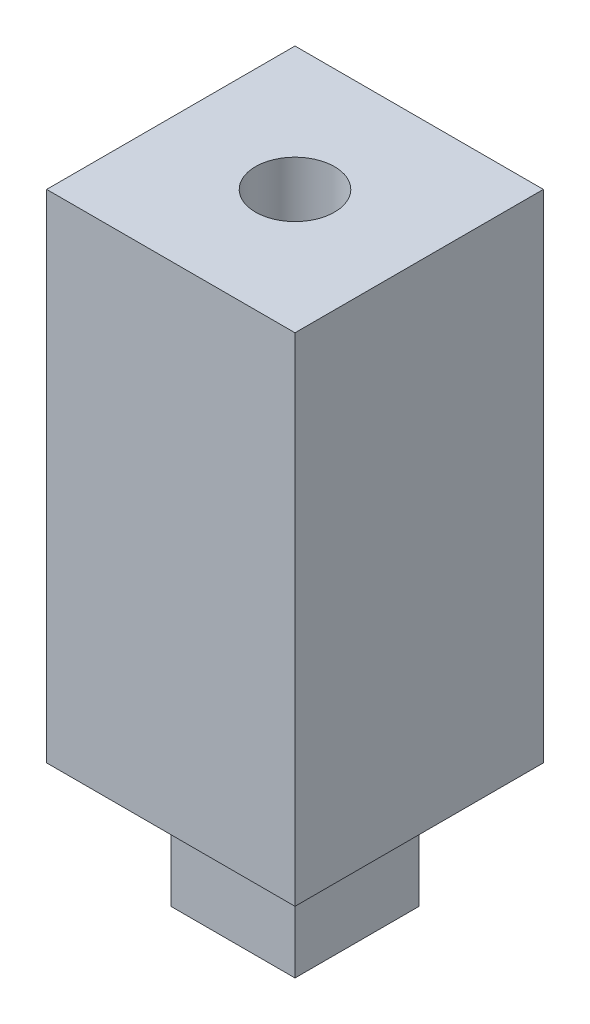
ISO-10303-21;
HEADER;
FILE_DESCRIPTION(('STEP AP214'),'2;1');
FILE_NAME('part.step','',(''),(''),'','','');
FILE_SCHEMA(('AUTOMOTIVE_DESIGN { 1 0 10303 214 1 1 1 1 }'));
ENDSEC;
DATA;
#1=APPLICATION_CONTEXT('core data for automotive mechanical design processes');
#2=APPLICATION_PROTOCOL_DEFINITION('international standard','automotive_design',2000,#1);
#3=PRODUCT_CONTEXT('',#1,'mechanical');
#4=PRODUCT('Part','Part','',(#3));
#5=PRODUCT_RELATED_PRODUCT_CATEGORY('part','',(#4));
#6=PRODUCT_DEFINITION_FORMATION('','',#4);
#7=PRODUCT_DEFINITION_CONTEXT('part definition',#1,'design');
#8=PRODUCT_DEFINITION('design','',#6,#7);
#9=PRODUCT_DEFINITION_SHAPE('','',#8);
#10=(LENGTH_UNIT() NAMED_UNIT(*) SI_UNIT(.MILLI.,.METRE.));
#11=(NAMED_UNIT(*) PLANE_ANGLE_UNIT() SI_UNIT($,.RADIAN.));
#12=(NAMED_UNIT(*) SI_UNIT($,.STERADIAN.) SOLID_ANGLE_UNIT());
#13=UNCERTAINTY_MEASURE_WITH_UNIT(LENGTH_MEASURE(1.E-05),#10,'distance_accuracy_value','');
#14=(GEOMETRIC_REPRESENTATION_CONTEXT(3) GLOBAL_UNCERTAINTY_ASSIGNED_CONTEXT((#13)) GLOBAL_UNIT_ASSIGNED_CONTEXT((#10,
#11,#12)) REPRESENTATION_CONTEXT('',''));
#15=CARTESIAN_POINT('',(0.,0.,0.));
#16=DIRECTION('',(0.,0.,1.));
#17=DIRECTION('',(1.,0.,0.));
#18=AXIS2_PLACEMENT_3D('',#15,#16,#17);
#19=CARTESIAN_POINT('',(0.,0.,0.));
#20=DIRECTION('',(0.,-1.,0.));
#21=DIRECTION('',(0.,0.,-1.));
#22=AXIS2_PLACEMENT_3D('',#19,#20,#21);
#23=PLANE('',#22);
#24=DIRECTION('',(0.,0.,-1.));
#25=VECTOR('',#24,1.);
#26=CARTESIAN_POINT('',(6.35,0.,6.35));
#27=LINE('',#26,#25);
#28=CARTESIAN_POINT('',(6.35,0.,6.35));
#29=VERTEX_POINT('',#28);
#30=CARTESIAN_POINT('',(6.35,0.,-6.35));
#31=VERTEX_POINT('',#30);
#32=EDGE_CURVE('E164',#29,#31,#27,.T.);
#33=ORIENTED_EDGE('',*,*,#32,.F.);
#34=DIRECTION('',(1.,0.,0.));
#35=VECTOR('',#34,1.);
#36=CARTESIAN_POINT('',(-6.35,0.,6.35));
#37=LINE('',#36,#35);
#38=CARTESIAN_POINT('',(-6.35,0.,6.35));
#39=VERTEX_POINT('',#38);
#40=EDGE_CURVE('E82',#39,#29,#37,.T.);
#41=ORIENTED_EDGE('',*,*,#40,.F.);
#42=DIRECTION('',(0.,0.,1.));
#43=VECTOR('',#42,1.);
#44=CARTESIAN_POINT('',(-6.35,0.,6.35));
#45=LINE('',#44,#43);
#46=CARTESIAN_POINT('',(-6.35,0.,-6.35));
#47=VERTEX_POINT('',#46);
#48=EDGE_CURVE('E176',#47,#39,#45,.T.);
#49=ORIENTED_EDGE('',*,*,#48,.F.);
#50=DIRECTION('',(-1.,0.,0.));
#51=VECTOR('',#50,1.);
#52=CARTESIAN_POINT('',(-6.35,0.,-6.35));
#53=LINE('',#52,#51);
#54=EDGE_CURVE('E174',#31,#47,#53,.T.);
#55=ORIENTED_EDGE('',*,*,#54,.F.);
#56=EDGE_LOOP('',(#33,#41,#49,#55));
#57=FACE_BOUND('',#56,.T.);
#58=DIRECTION('',(1.,0.,0.));
#59=VECTOR('',#58,1.);
#60=CARTESIAN_POINT('',(3.175,0.,-3.175));
#61=LINE('',#60,#59);
#62=CARTESIAN_POINT('',(-3.175,0.,-3.175));
#63=VERTEX_POINT('',#62);
#64=CARTESIAN_POINT('',(3.175,0.,-3.175));
#65=VERTEX_POINT('',#64);
#66=EDGE_CURVE('E151',#63,#65,#61,.T.);
#67=ORIENTED_EDGE('',*,*,#66,.F.);
#68=DIRECTION('',(0.,0.,-1.));
#69=VECTOR('',#68,1.);
#70=CARTESIAN_POINT('',(-3.175,0.,3.175));
#71=LINE('',#70,#69);
#72=CARTESIAN_POINT('',(-3.175,0.,3.175));
#73=VERTEX_POINT('',#72);
#74=EDGE_CURVE('E137',#73,#63,#71,.T.);
#75=ORIENTED_EDGE('',*,*,#74,.F.);
#76=DIRECTION('',(-1.,0.,0.));
#77=VECTOR('',#76,1.);
#78=CARTESIAN_POINT('',(3.175,0.,3.175));
#79=LINE('',#78,#77);
#80=CARTESIAN_POINT('',(3.175,0.,3.175));
#81=VERTEX_POINT('',#80);
#82=EDGE_CURVE('E142',#81,#73,#79,.T.);
#83=ORIENTED_EDGE('',*,*,#82,.F.);
#84=DIRECTION('',(0.,0.,1.));
#85=VECTOR('',#84,1.);
#86=CARTESIAN_POINT('',(3.175,0.,3.175));
#87=LINE('',#86,#85);
#88=EDGE_CURVE('E153',#65,#81,#87,.T.);
#89=ORIENTED_EDGE('',*,*,#88,.F.);
#90=EDGE_LOOP('',(#67,#75,#83,#89));
#91=FACE_BOUND('',#90,.T.);
#92=ADVANCED_FACE('F37',(#57,#91),#23,.T.);
#93=CARTESIAN_POINT('',(6.35,25.4,6.35));
#94=DIRECTION('',(-1.,0.,0.));
#95=DIRECTION('',(0.,0.,1.));
#96=AXIS2_PLACEMENT_3D('',#93,#94,#95);
#97=PLANE('',#96);
#98=ORIENTED_EDGE('',*,*,#32,.T.);
#99=DIRECTION('',(0.,-1.,0.));
#100=VECTOR('',#99,1.);
#101=CARTESIAN_POINT('',(6.35,25.4,-6.35));
#102=LINE('',#101,#100);
#103=CARTESIAN_POINT('',(6.35,25.4,-6.35));
#104=VERTEX_POINT('',#103);
#105=EDGE_CURVE('E11',#104,#31,#102,.T.);
#106=ORIENTED_EDGE('',*,*,#105,.F.);
#107=DIRECTION('',(0.,0.,-1.));
#108=VECTOR('',#107,1.);
#109=CARTESIAN_POINT('',(6.35,25.4,6.35));
#110=LINE('',#109,#108);
#111=CARTESIAN_POINT('',(6.35,25.4,6.35));
#112=VERTEX_POINT('',#111);
#113=EDGE_CURVE('E165',#112,#104,#110,.T.);
#114=ORIENTED_EDGE('',*,*,#113,.F.);
#115=DIRECTION('',(0.,-1.,0.));
#116=VECTOR('',#115,1.);
#117=CARTESIAN_POINT('',(6.35,25.4,6.35));
#118=LINE('',#117,#116);
#119=EDGE_CURVE('E171',#112,#29,#118,.T.);
#120=ORIENTED_EDGE('',*,*,#119,.T.);
#121=EDGE_LOOP('',(#98,#106,#114,#120));
#122=FACE_BOUND('',#121,.T.);
#123=ADVANCED_FACE('F39',(#122),#97,.F.);
#124=CARTESIAN_POINT('',(-6.35,25.4,-6.35));
#125=DIRECTION('',(0.,0.,1.));
#126=DIRECTION('',(1.,0.,0.));
#127=AXIS2_PLACEMENT_3D('',#124,#125,#126);
#128=PLANE('',#127);
#129=ORIENTED_EDGE('',*,*,#54,.T.);
#130=DIRECTION('',(0.,-1.,0.));
#131=VECTOR('',#130,1.);
#132=CARTESIAN_POINT('',(-6.35,25.4,-6.35));
#133=LINE('',#132,#131);
#134=CARTESIAN_POINT('',(-6.35,25.4,-6.35));
#135=VERTEX_POINT('',#134);
#136=EDGE_CURVE('E45',#135,#47,#133,.T.);
#137=ORIENTED_EDGE('',*,*,#136,.F.);
#138=DIRECTION('',(-1.,0.,0.));
#139=VECTOR('',#138,1.);
#140=CARTESIAN_POINT('',(-6.35,25.4,-6.35));
#141=LINE('',#140,#139);
#142=EDGE_CURVE('E89',#104,#135,#141,.T.);
#143=ORIENTED_EDGE('',*,*,#142,.F.);
#144=ORIENTED_EDGE('',*,*,#105,.T.);
#145=EDGE_LOOP('',(#129,#137,#143,#144));
#146=FACE_BOUND('',#145,.T.);
#147=ADVANCED_FACE('F204',(#146),#128,.F.);
#148=CARTESIAN_POINT('',(-6.35,25.4,6.35));
#149=DIRECTION('',(1.,0.,0.));
#150=DIRECTION('',(0.,0.,-1.));
#151=AXIS2_PLACEMENT_3D('',#148,#149,#150);
#152=PLANE('',#151);
#153=ORIENTED_EDGE('',*,*,#48,.T.);
#154=DIRECTION('',(0.,-1.,0.));
#155=VECTOR('',#154,1.);
#156=CARTESIAN_POINT('',(-6.35,25.4,6.35));
#157=LINE('',#156,#155);
#158=CARTESIAN_POINT('',(-6.35,25.4,6.35));
#159=VERTEX_POINT('',#158);
#160=EDGE_CURVE('E180',#159,#39,#157,.T.);
#161=ORIENTED_EDGE('',*,*,#160,.F.);
#162=DIRECTION('',(0.,0.,1.));
#163=VECTOR('',#162,1.);
#164=CARTESIAN_POINT('',(-6.35,25.4,6.35));
#165=LINE('',#164,#163);
#166=EDGE_CURVE('E168',#135,#159,#165,.T.);
#167=ORIENTED_EDGE('',*,*,#166,.F.);
#168=ORIENTED_EDGE('',*,*,#136,.T.);
#169=EDGE_LOOP('',(#153,#161,#167,#168));
#170=FACE_BOUND('',#169,.T.);
#171=ADVANCED_FACE('F185',(#170),#152,.F.);
#172=CARTESIAN_POINT('',(-6.35,25.4,6.35));
#173=DIRECTION('',(0.,0.,-1.));
#174=DIRECTION('',(-1.,0.,0.));
#175=AXIS2_PLACEMENT_3D('',#172,#173,#174);
#176=PLANE('',#175);
#177=ORIENTED_EDGE('',*,*,#40,.T.);
#178=ORIENTED_EDGE('',*,*,#119,.F.);
#179=DIRECTION('',(1.,0.,0.));
#180=VECTOR('',#179,1.);
#181=CARTESIAN_POINT('',(-6.35,25.4,6.35));
#182=LINE('',#181,#180);
#183=EDGE_CURVE('E61',#159,#112,#182,.T.);
#184=ORIENTED_EDGE('',*,*,#183,.F.);
#185=ORIENTED_EDGE('',*,*,#160,.T.);
#186=EDGE_LOOP('',(#177,#178,#184,#185));
#187=FACE_BOUND('',#186,.T.);
#188=ADVANCED_FACE('F193',(#187),#176,.F.);
#189=CARTESIAN_POINT('',(0.,25.4,0.));
#190=DIRECTION('',(0.,-1.,0.));
#191=DIRECTION('',(0.,0.,-1.));
#192=AXIS2_PLACEMENT_3D('',#189,#190,#191);
#193=PLANE('',#192);
#194=CARTESIAN_POINT('',(0.,25.4,0.));
#195=DIRECTION('',(0.,1.,0.));
#196=DIRECTION('',(0.,0.,1.));
#197=AXIS2_PLACEMENT_3D('',#194,#195,#196);
#198=CIRCLE('',#197,2.01929999999999);
#199=CARTESIAN_POINT('',(0.,25.4,2.01929999999999));
#200=VERTEX_POINT('',#199);
#201=EDGE_CURVE('E127',#200,#200,#198,.T.);
#202=ORIENTED_EDGE('',*,*,#201,.F.);
#203=EDGE_LOOP('',(#202));
#204=FACE_BOUND('',#203,.T.);
#205=ORIENTED_EDGE('',*,*,#113,.T.);
#206=ORIENTED_EDGE('',*,*,#142,.T.);
#207=ORIENTED_EDGE('',*,*,#166,.T.);
#208=ORIENTED_EDGE('',*,*,#183,.T.);
#209=EDGE_LOOP('',(#205,#206,#207,#208));
#210=FACE_BOUND('',#209,.T.);
#211=ADVANCED_FACE('F195',(#204,#210),#193,.F.);
#212=CARTESIAN_POINT('',(-3.175,-6.35,3.175));
#213=DIRECTION('',(1.,0.,0.));
#214=DIRECTION('',(0.,0.,-1.));
#215=AXIS2_PLACEMENT_3D('',#212,#213,#214);
#216=PLANE('',#215);
#217=ORIENTED_EDGE('',*,*,#74,.T.);
#218=DIRECTION('',(0.,1.,0.));
#219=VECTOR('',#218,1.);
#220=CARTESIAN_POINT('',(-3.175,-6.35,-3.175));
#221=LINE('',#220,#219);
#222=CARTESIAN_POINT('',(-3.175,-6.35,-3.175));
#223=VERTEX_POINT('',#222);
#224=EDGE_CURVE('E162',#223,#63,#221,.T.);
#225=ORIENTED_EDGE('',*,*,#224,.F.);
#226=DIRECTION('',(0.,0.,-1.));
#227=VECTOR('',#226,1.);
#228=CARTESIAN_POINT('',(-3.175,-6.35,3.175));
#229=LINE('',#228,#227);
#230=CARTESIAN_POINT('',(-3.175,-6.35,3.175));
#231=VERTEX_POINT('',#230);
#232=EDGE_CURVE('E138',#231,#223,#229,.T.);
#233=ORIENTED_EDGE('',*,*,#232,.F.);
#234=DIRECTION('',(0.,1.,0.));
#235=VECTOR('',#234,1.);
#236=CARTESIAN_POINT('',(-3.175,-6.35,3.175));
#237=LINE('',#236,#235);
#238=EDGE_CURVE('E148',#231,#73,#237,.T.);
#239=ORIENTED_EDGE('',*,*,#238,.T.);
#240=EDGE_LOOP('',(#217,#225,#233,#239));
#241=FACE_BOUND('',#240,.T.);
#242=ADVANCED_FACE('F201',(#241),#216,.F.);
#243=CARTESIAN_POINT('',(3.175,-6.35,-3.175));
#244=DIRECTION('',(0.,0.,1.));
#245=DIRECTION('',(1.,0.,0.));
#246=AXIS2_PLACEMENT_3D('',#243,#244,#245);
#247=PLANE('',#246);
#248=ORIENTED_EDGE('',*,*,#66,.T.);
#249=DIRECTION('',(0.,1.,0.));
#250=VECTOR('',#249,1.);
#251=CARTESIAN_POINT('',(3.175,-6.35,-3.175));
#252=LINE('',#251,#250);
#253=CARTESIAN_POINT('',(3.175,-6.35,-3.175));
#254=VERTEX_POINT('',#253);
#255=EDGE_CURVE('E159',#254,#65,#252,.T.);
#256=ORIENTED_EDGE('',*,*,#255,.F.);
#257=DIRECTION('',(1.,0.,0.));
#258=VECTOR('',#257,1.);
#259=CARTESIAN_POINT('',(3.175,-6.35,-3.175));
#260=LINE('',#259,#258);
#261=EDGE_CURVE('E141',#223,#254,#260,.T.);
#262=ORIENTED_EDGE('',*,*,#261,.F.);
#263=ORIENTED_EDGE('',*,*,#224,.T.);
#264=EDGE_LOOP('',(#248,#256,#262,#263));
#265=FACE_BOUND('',#264,.T.);
#266=ADVANCED_FACE('F214',(#265),#247,.F.);
#267=CARTESIAN_POINT('',(3.175,-6.35,3.175));
#268=DIRECTION('',(-1.,0.,0.));
#269=DIRECTION('',(0.,0.,1.));
#270=AXIS2_PLACEMENT_3D('',#267,#268,#269);
#271=PLANE('',#270);
#272=ORIENTED_EDGE('',*,*,#88,.T.);
#273=DIRECTION('',(0.,1.,0.));
#274=VECTOR('',#273,1.);
#275=CARTESIAN_POINT('',(3.175,-6.35,3.175));
#276=LINE('',#275,#274);
#277=CARTESIAN_POINT('',(3.175,-6.35,3.175));
#278=VERTEX_POINT('',#277);
#279=EDGE_CURVE('E52',#278,#81,#276,.T.);
#280=ORIENTED_EDGE('',*,*,#279,.F.);
#281=DIRECTION('',(0.,0.,1.));
#282=VECTOR('',#281,1.);
#283=CARTESIAN_POINT('',(3.175,-6.35,3.175));
#284=LINE('',#283,#282);
#285=EDGE_CURVE('E144',#254,#278,#284,.T.);
#286=ORIENTED_EDGE('',*,*,#285,.F.);
#287=ORIENTED_EDGE('',*,*,#255,.T.);
#288=EDGE_LOOP('',(#272,#280,#286,#287));
#289=FACE_BOUND('',#288,.T.);
#290=ADVANCED_FACE('F218',(#289),#271,.F.);
#291=CARTESIAN_POINT('',(3.175,-6.35,3.175));
#292=DIRECTION('',(0.,0.,-1.));
#293=DIRECTION('',(-1.,0.,0.));
#294=AXIS2_PLACEMENT_3D('',#291,#292,#293);
#295=PLANE('',#294);
#296=ORIENTED_EDGE('',*,*,#82,.T.);
#297=ORIENTED_EDGE('',*,*,#238,.F.);
#298=DIRECTION('',(-1.,0.,0.));
#299=VECTOR('',#298,1.);
#300=CARTESIAN_POINT('',(3.175,-6.35,3.175));
#301=LINE('',#300,#299);
#302=EDGE_CURVE('E146',#278,#231,#301,.T.);
#303=ORIENTED_EDGE('',*,*,#302,.F.);
#304=ORIENTED_EDGE('',*,*,#279,.T.);
#305=EDGE_LOOP('',(#296,#297,#303,#304));
#306=FACE_BOUND('',#305,.T.);
#307=ADVANCED_FACE('F222',(#306),#295,.F.);
#308=CARTESIAN_POINT('',(0.,-6.35,0.));
#309=DIRECTION('',(0.,1.,0.));
#310=DIRECTION('',(0.,0.,1.));
#311=AXIS2_PLACEMENT_3D('',#308,#309,#310);
#312=PLANE('',#311);
#313=CARTESIAN_POINT('',(0.,-6.35,0.));
#314=DIRECTION('',(0.,-1.,0.));
#315=DIRECTION('',(0.,0.,-1.));
#316=AXIS2_PLACEMENT_3D('',#313,#314,#315);
#317=CIRCLE('',#316,2.0193);
#318=CARTESIAN_POINT('',(0.,-6.35,-2.0193));
#319=VERTEX_POINT('',#318);
#320=EDGE_CURVE('E126',#319,#319,#317,.T.);
#321=ORIENTED_EDGE('',*,*,#320,.F.);
#322=EDGE_LOOP('',(#321));
#323=FACE_BOUND('',#322,.T.);
#324=ORIENTED_EDGE('',*,*,#232,.T.);
#325=ORIENTED_EDGE('',*,*,#261,.T.);
#326=ORIENTED_EDGE('',*,*,#285,.T.);
#327=ORIENTED_EDGE('',*,*,#302,.T.);
#328=EDGE_LOOP('',(#324,#325,#326,#327));
#329=FACE_BOUND('',#328,.T.);
#330=ADVANCED_FACE('F226',(#323,#329),#312,.F.);
#331=CARTESIAN_POINT('',(0.,6.35,0.));
#332=DIRECTION('',(0.,-1.,0.));
#333=DIRECTION('',(0.,0.,-1.));
#334=AXIS2_PLACEMENT_3D('',#331,#332,#333);
#335=CONICAL_SURFACE('',#334,2.0193,1.02974425867665);
#336=CARTESIAN_POINT('',(0.,7.56331784800235,0.));
#337=VERTEX_POINT('',#336);
#338=VERTEX_LOOP('',#337);
#339=FACE_BOUND('',#338,.T.);
#340=CARTESIAN_POINT('',(0.,6.35,0.));
#341=DIRECTION('',(0.,-1.,0.));
#342=DIRECTION('',(0.,0.,-1.));
#343=AXIS2_PLACEMENT_3D('',#340,#341,#342);
#344=CIRCLE('',#343,2.0193);
#345=CARTESIAN_POINT('',(0.,6.35,-2.0193));
#346=VERTEX_POINT('',#345);
#347=EDGE_CURVE('E130',#346,#346,#344,.T.);
#348=ORIENTED_EDGE('',*,*,#347,.T.);
#349=EDGE_LOOP('',(#348));
#350=FACE_BOUND('',#349,.T.);
#351=ADVANCED_FACE('F229',(#339,#350),#335,.F.);
#352=CARTESIAN_POINT('',(0.,-6.35,0.));
#353=DIRECTION('',(0.,-1.,0.));
#354=DIRECTION('',(0.,0.,-1.));
#355=AXIS2_PLACEMENT_3D('',#352,#353,#354);
#356=CYLINDRICAL_SURFACE('',#355,2.0193);
#357=ORIENTED_EDGE('',*,*,#347,.F.);
#358=EDGE_LOOP('',(#357));
#359=FACE_BOUND('',#358,.T.);
#360=ORIENTED_EDGE('',*,*,#320,.T.);
#361=EDGE_LOOP('',(#360));
#362=FACE_BOUND('',#361,.T.);
#363=ADVANCED_FACE('F120',(#359,#362),#356,.F.);
#364=CARTESIAN_POINT('',(0.,12.7,0.));
#365=DIRECTION('',(0.,1.,0.));
#366=DIRECTION('',(0.,0.,1.));
#367=AXIS2_PLACEMENT_3D('',#364,#365,#366);
#368=CONICAL_SURFACE('',#367,2.01929999999999,1.02974425867665);
#369=CARTESIAN_POINT('',(0.,11.4866821519976,0.));
#370=VERTEX_POINT('',#369);
#371=VERTEX_LOOP('',#370);
#372=FACE_BOUND('',#371,.T.);
#373=CARTESIAN_POINT('',(0.,12.7,0.));
#374=DIRECTION('',(0.,1.,0.));
#375=DIRECTION('',(0.,0.,1.));
#376=AXIS2_PLACEMENT_3D('',#373,#374,#375);
#377=CIRCLE('',#376,2.01929999999999);
#378=CARTESIAN_POINT('',(0.,12.7,2.01929999999999));
#379=VERTEX_POINT('',#378);
#380=EDGE_CURVE('E124',#379,#379,#377,.T.);
#381=ORIENTED_EDGE('',*,*,#380,.T.);
#382=EDGE_LOOP('',(#381));
#383=FACE_BOUND('',#382,.T.);
#384=ADVANCED_FACE('F116',(#372,#383),#368,.F.);
#385=CARTESIAN_POINT('',(0.,25.4,0.));
#386=DIRECTION('',(0.,1.,0.));
#387=DIRECTION('',(0.,0.,1.));
#388=AXIS2_PLACEMENT_3D('',#385,#386,#387);
#389=CYLINDRICAL_SURFACE('',#388,2.01929999999999);
#390=ORIENTED_EDGE('',*,*,#380,.F.);
#391=EDGE_LOOP('',(#390));
#392=FACE_BOUND('',#391,.T.);
#393=ORIENTED_EDGE('',*,*,#201,.T.);
#394=EDGE_LOOP('',(#393));
#395=FACE_BOUND('',#394,.T.);
#396=ADVANCED_FACE('F119',(#392,#395),#389,.F.);
#397=CLOSED_SHELL('',(#92,#123,#147,#171,#188,#211,#242,#266,#290,#307,#330,#351,#363,#384,#396));
#398=MANIFOLD_SOLID_BREP('B2',#397);
#399=ADVANCED_BREP_SHAPE_REPRESENTATION('',(#18,#398),#14);
#400=SHAPE_DEFINITION_REPRESENTATION(#9,#399);
ENDSEC;
END-ISO-10303-21;
